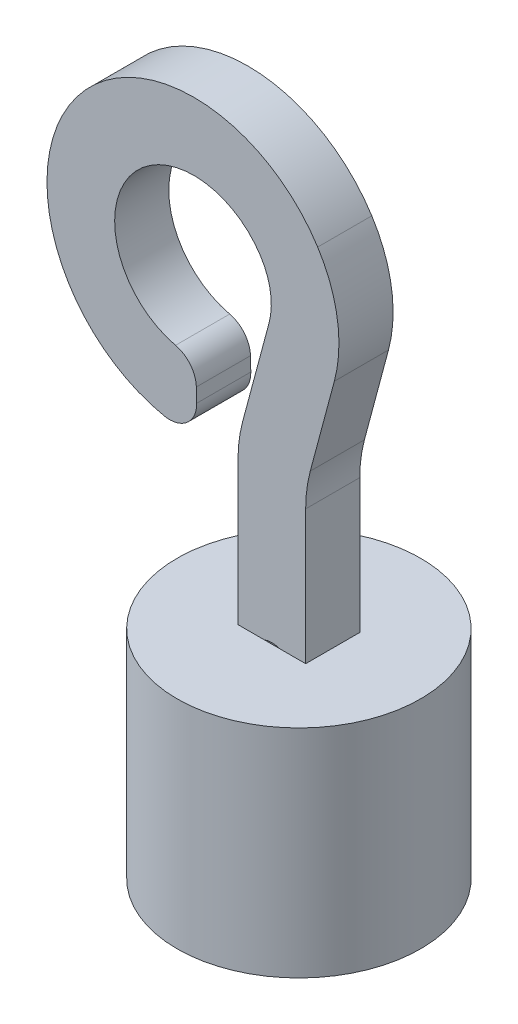
ISO-10303-21;
HEADER;
FILE_DESCRIPTION(('STEP AP214'),'2;1');
FILE_NAME('part.step','',(''),(''),'','','');
FILE_SCHEMA(('AUTOMOTIVE_DESIGN { 1 0 10303 214 1 1 1 1 }'));
ENDSEC;
DATA;
#1=APPLICATION_CONTEXT('core data for automotive mechanical design processes');
#2=APPLICATION_PROTOCOL_DEFINITION('international standard','automotive_design',2000,#1);
#3=PRODUCT_CONTEXT('',#1,'mechanical');
#4=PRODUCT('Part','Part','',(#3));
#5=PRODUCT_RELATED_PRODUCT_CATEGORY('part','',(#4));
#6=PRODUCT_DEFINITION_FORMATION('','',#4);
#7=PRODUCT_DEFINITION_CONTEXT('part definition',#1,'design');
#8=PRODUCT_DEFINITION('design','',#6,#7);
#9=PRODUCT_DEFINITION_SHAPE('','',#8);
#10=(LENGTH_UNIT() NAMED_UNIT(*) SI_UNIT(.MILLI.,.METRE.));
#11=(NAMED_UNIT(*) PLANE_ANGLE_UNIT() SI_UNIT($,.RADIAN.));
#12=(NAMED_UNIT(*) SI_UNIT($,.STERADIAN.) SOLID_ANGLE_UNIT());
#13=UNCERTAINTY_MEASURE_WITH_UNIT(LENGTH_MEASURE(1.E-05),#10,'distance_accuracy_value','');
#14=(GEOMETRIC_REPRESENTATION_CONTEXT(3) GLOBAL_UNCERTAINTY_ASSIGNED_CONTEXT((#13)) GLOBAL_UNIT_ASSIGNED_CONTEXT((#10,
#11,#12)) REPRESENTATION_CONTEXT('',''));
#15=CARTESIAN_POINT('',(0.,0.,0.));
#16=DIRECTION('',(0.,0.,1.));
#17=DIRECTION('',(1.,0.,0.));
#18=AXIS2_PLACEMENT_3D('',#15,#16,#17);
#19=CARTESIAN_POINT('',(-79.7540999308262,11.1014788973685,33.941295670284));
#20=DIRECTION('',(0.,0.,-1.));
#21=DIRECTION('',(-1.,0.,0.));
#22=AXIS2_PLACEMENT_3D('',#19,#20,#21);
#23=PLANE('',#22);
#24=CARTESIAN_POINT('',(-77.2540999308262,19.6014788973685,33.941295670284));
#25=DIRECTION('',(0.,0.,-1.));
#26=DIRECTION('',(0.,1.,0.));
#27=AXIS2_PLACEMENT_3D('',#24,#25,#26);
#28=CIRCLE('',#27,1.6);
#29=CARTESIAN_POINT('',(-76.6973234945432,21.1014788973685,33.941295670284));
#30=VERTEX_POINT('',#29);
#31=CARTESIAN_POINT('',(-77.8108763671092,21.1014788973685,33.941295670284));
#32=VERTEX_POINT('',#31);
#33=EDGE_CURVE('E213',#30,#32,#28,.T.);
#34=ORIENTED_EDGE('',*,*,#33,.F.);
#35=DIRECTION('',(-1.,0.,0.));
#36=VECTOR('',#35,1.);
#37=CARTESIAN_POINT('',(-79.7540999308262,21.1014788973685,33.941295670284));
#38=LINE('',#37,#36);
#39=EDGE_CURVE('E325',#30,#32,#38,.T.);
#40=ORIENTED_EDGE('',*,*,#39,.T.);
#41=EDGE_LOOP('',(#34,#40));
#42=FACE_BOUND('',#41,.T.);
#43=ADVANCED_FACE('F33',(#42),#23,.F.);
#44=CARTESIAN_POINT('',(-79.7540999308262,11.1014788973685,37.941295670284));
#45=DIRECTION('',(0.,0.,1.));
#46=DIRECTION('',(1.,0.,0.));
#47=AXIS2_PLACEMENT_3D('',#44,#45,#46);
#48=PLANE('',#47);
#49=CARTESIAN_POINT('',(-77.2540999308262,19.6014788973685,37.941295670284));
#50=DIRECTION('',(0.,0.,1.));
#51=DIRECTION('',(0.,-1.,0.));
#52=AXIS2_PLACEMENT_3D('',#49,#50,#51);
#53=CIRCLE('',#52,1.6);
#54=CARTESIAN_POINT('',(-77.8108763671092,21.1014788973685,37.941295670284));
#55=VERTEX_POINT('',#54);
#56=CARTESIAN_POINT('',(-76.6973234945432,21.1014788973685,37.941295670284));
#57=VERTEX_POINT('',#56);
#58=EDGE_CURVE('E205',#55,#57,#53,.T.);
#59=ORIENTED_EDGE('',*,*,#58,.F.);
#60=DIRECTION('',(1.,0.,0.));
#61=VECTOR('',#60,1.);
#62=CARTESIAN_POINT('',(-79.7540999308262,21.1014788973685,37.941295670284));
#63=LINE('',#62,#61);
#64=EDGE_CURVE('E318',#55,#57,#63,.T.);
#65=ORIENTED_EDGE('',*,*,#64,.T.);
#66=EDGE_LOOP('',(#59,#65));
#67=FACE_BOUND('',#66,.T.);
#68=ADVANCED_FACE('F344',(#67),#48,.F.);
#69=CARTESIAN_POINT('',(-82.7040999308262,21.1014788973685,35.941295670284));
#70=DIRECTION('',(0.,1.,0.));
#71=DIRECTION('',(0.,0.,1.));
#72=AXIS2_PLACEMENT_3D('',#69,#70,#71);
#73=PLANE('',#72);
#74=DIRECTION('',(0.,0.,1.));
#75=VECTOR('',#74,1.);
#76=CARTESIAN_POINT('',(-79.7540999308262,21.1014788973685,37.941295670284));
#77=LINE('',#76,#75);
#78=CARTESIAN_POINT('',(-79.7540999308262,21.1014788973685,33.941295670284));
#79=VERTEX_POINT('',#78);
#80=CARTESIAN_POINT('',(-79.7540999308262,21.1014788973685,37.941295670284));
#81=VERTEX_POINT('',#80);
#82=EDGE_CURVE('E315',#79,#81,#77,.T.);
#83=ORIENTED_EDGE('',*,*,#82,.F.);
#84=DIRECTION('',(-1.,0.,0.));
#85=VECTOR('',#84,1.);
#86=CARTESIAN_POINT('',(-82.7040999308262,21.1014788973685,33.941295670284));
#87=LINE('',#86,#85);
#88=EDGE_CURVE('E311',#32,#79,#87,.T.);
#89=ORIENTED_EDGE('',*,*,#88,.F.);
#90=ORIENTED_EDGE('',*,*,#39,.F.);
#91=CARTESIAN_POINT('',(-74.7540999308262,21.1014788973685,33.941295670284));
#92=VERTEX_POINT('',#91);
#93=EDGE_CURVE('E326',#92,#30,#38,.T.);
#94=ORIENTED_EDGE('',*,*,#93,.F.);
#95=DIRECTION('',(0.,0.,-1.));
#96=VECTOR('',#95,1.);
#97=CARTESIAN_POINT('',(-74.7540999308262,21.1014788973685,37.941295670284));
#98=LINE('',#97,#96);
#99=CARTESIAN_POINT('',(-74.7540999308262,21.1014788973685,37.941295670284));
#100=VERTEX_POINT('',#99);
#101=EDGE_CURVE('E322',#100,#92,#98,.T.);
#102=ORIENTED_EDGE('',*,*,#101,.F.);
#103=DIRECTION('',(-1.,0.,0.));
#104=VECTOR('',#103,1.);
#105=CARTESIAN_POINT('',(-82.7040999308262,21.1014788973685,37.941295670284));
#106=LINE('',#105,#104);
#107=EDGE_CURVE('E56',#100,#57,#106,.T.);
#108=ORIENTED_EDGE('',*,*,#107,.T.);
#109=ORIENTED_EDGE('',*,*,#64,.F.);
#110=EDGE_CURVE('E319',#81,#55,#63,.T.);
#111=ORIENTED_EDGE('',*,*,#110,.F.);
#112=EDGE_LOOP('',(#83,#89,#90,#94,#102,#108,#109,#111));
#113=FACE_BOUND('',#112,.T.);
#114=CARTESIAN_POINT('',(-77.2540999308262,21.1014788973685,35.941295670284));
#115=DIRECTION('',(0.,1.,0.));
#116=DIRECTION('',(0.,0.,1.));
#117=AXIS2_PLACEMENT_3D('',#114,#115,#116);
#118=CIRCLE('',#117,9.);
#119=CARTESIAN_POINT('',(-77.2540999308262,21.1014788973685,44.941295670284));
#120=VERTEX_POINT('',#119);
#121=EDGE_CURVE('E41',#120,#120,#118,.T.);
#122=ORIENTED_EDGE('',*,*,#121,.T.);
#123=EDGE_LOOP('',(#122));
#124=FACE_BOUND('',#123,.T.);
#125=ADVANCED_FACE('F331',(#113,#124),#73,.T.);
#126=CARTESIAN_POINT('',(-77.2540999308262,5.10147889736845,35.941295670284));
#127=DIRECTION('',(0.,1.,0.));
#128=DIRECTION('',(0.,0.,1.));
#129=AXIS2_PLACEMENT_3D('',#126,#127,#128);
#130=CYLINDRICAL_SURFACE('',#129,9.);
#131=CARTESIAN_POINT('',(-77.2540999308262,5.10147889736845,35.941295670284));
#132=DIRECTION('',(0.,1.,0.));
#133=DIRECTION('',(0.,0.,1.));
#134=AXIS2_PLACEMENT_3D('',#131,#132,#133);
#135=CIRCLE('',#134,9.);
#136=CARTESIAN_POINT('',(-77.2540999308262,5.10147889736845,44.941295670284));
#137=VERTEX_POINT('',#136);
#138=EDGE_CURVE('E11',#137,#137,#135,.T.);
#139=ORIENTED_EDGE('',*,*,#138,.T.);
#140=EDGE_LOOP('',(#139));
#141=FACE_BOUND('',#140,.T.);
#142=ORIENTED_EDGE('',*,*,#121,.F.);
#143=EDGE_LOOP('',(#142));
#144=FACE_BOUND('',#143,.T.);
#145=ADVANCED_FACE('F35',(#141,#144),#130,.T.);
#146=CARTESIAN_POINT('',(-77.2540999308262,5.10147889736845,35.941295670284));
#147=DIRECTION('',(0.,1.,0.));
#148=DIRECTION('',(0.,0.,1.));
#149=AXIS2_PLACEMENT_3D('',#146,#147,#148);
#150=PLANE('',#149);
#151=DIRECTION('',(1.,0.,0.));
#152=VECTOR('',#151,1.);
#153=CARTESIAN_POINT('',(-80.2540999308262,5.10147889736845,33.941295670284));
#154=LINE('',#153,#152);
#155=CARTESIAN_POINT('',(-80.2540999308262,5.10147889736845,33.941295670284));
#156=VERTEX_POINT('',#155);
#157=CARTESIAN_POINT('',(-74.2540999308262,5.10147889736845,33.941295670284));
#158=VERTEX_POINT('',#157);
#159=EDGE_CURVE('E199',#156,#158,#154,.T.);
#160=ORIENTED_EDGE('',*,*,#159,.F.);
#161=DIRECTION('',(0.,0.,-1.));
#162=VECTOR('',#161,1.);
#163=CARTESIAN_POINT('',(-80.2540999308262,5.10147889736845,37.941295670284));
#164=LINE('',#163,#162);
#165=CARTESIAN_POINT('',(-80.2540999308262,5.10147889736845,37.941295670284));
#166=VERTEX_POINT('',#165);
#167=EDGE_CURVE('E48',#166,#156,#164,.T.);
#168=ORIENTED_EDGE('',*,*,#167,.F.);
#169=DIRECTION('',(-1.,0.,0.));
#170=VECTOR('',#169,1.);
#171=CARTESIAN_POINT('',(-80.2540999308262,5.10147889736845,37.941295670284));
#172=LINE('',#171,#170);
#173=CARTESIAN_POINT('',(-74.2540999308262,5.10147889736845,37.941295670284));
#174=VERTEX_POINT('',#173);
#175=EDGE_CURVE('E190',#174,#166,#172,.T.);
#176=ORIENTED_EDGE('',*,*,#175,.F.);
#177=DIRECTION('',(0.,0.,1.));
#178=VECTOR('',#177,1.);
#179=CARTESIAN_POINT('',(-74.2540999308262,5.10147889736845,37.941295670284));
#180=LINE('',#179,#178);
#181=EDGE_CURVE('E193',#158,#174,#180,.T.);
#182=ORIENTED_EDGE('',*,*,#181,.F.);
#183=EDGE_LOOP('',(#160,#168,#176,#182));
#184=FACE_BOUND('',#183,.T.);
#185=ORIENTED_EDGE('',*,*,#138,.F.);
#186=EDGE_LOOP('',(#185));
#187=FACE_BOUND('',#186,.T.);
#188=ADVANCED_FACE('F334',(#184,#187),#150,.F.);
#189=CARTESIAN_POINT('',(-74.7540999308262,17.1014788973685,33.941295670284));
#190=DIRECTION('',(1.,0.,0.));
#191=DIRECTION('',(0.,1.,0.));
#192=AXIS2_PLACEMENT_3D('',#189,#190,#191);
#193=PLANE('',#192);
#194=DIRECTION('',(0.,1.,0.));
#195=VECTOR('',#194,1.);
#196=CARTESIAN_POINT('',(-74.7540999308262,17.1014788973685,37.941295670284));
#197=LINE('',#196,#195);
#198=CARTESIAN_POINT('',(-74.7540999308262,31.0104431729025,37.941295670284));
#199=VERTEX_POINT('',#198);
#200=EDGE_CURVE('E216',#100,#199,#197,.T.);
#201=ORIENTED_EDGE('',*,*,#200,.F.);
#202=ORIENTED_EDGE('',*,*,#101,.T.);
#203=DIRECTION('',(0.,1.,0.));
#204=VECTOR('',#203,1.);
#205=CARTESIAN_POINT('',(-74.7540999308262,17.1014788973685,33.941295670284));
#206=LINE('',#205,#204);
#207=CARTESIAN_POINT('',(-74.7540999308262,31.0104431729025,33.941295670284));
#208=VERTEX_POINT('',#207);
#209=EDGE_CURVE('E217',#92,#208,#206,.T.);
#210=ORIENTED_EDGE('',*,*,#209,.T.);
#211=DIRECTION('',(0.,0.,1.));
#212=VECTOR('',#211,1.);
#213=CARTESIAN_POINT('',(-74.7540999308262,31.0104431729025,33.941295670284));
#214=LINE('',#213,#212);
#215=EDGE_CURVE('E242',#208,#199,#214,.T.);
#216=ORIENTED_EDGE('',*,*,#215,.T.);
#217=EDGE_LOOP('',(#201,#202,#210,#216));
#218=FACE_BOUND('',#217,.T.);
#219=ADVANCED_FACE('F341',(#218),#193,.T.);
#220=CARTESIAN_POINT('',(-79.7540999308262,17.1014788973685,33.941295670284));
#221=DIRECTION('',(-1.,0.,0.));
#222=DIRECTION('',(0.,-1.,0.));
#223=AXIS2_PLACEMENT_3D('',#220,#221,#222);
#224=PLANE('',#223);
#225=DIRECTION('',(0.,-1.,0.));
#226=VECTOR('',#225,1.);
#227=CARTESIAN_POINT('',(-79.7540999308262,17.1014788973685,33.941295670284));
#228=LINE('',#227,#226);
#229=CARTESIAN_POINT('',(-79.7540999308262,31.6687056608394,33.941295670284));
#230=VERTEX_POINT('',#229);
#231=EDGE_CURVE('E239',#230,#79,#228,.T.);
#232=ORIENTED_EDGE('',*,*,#231,.T.);
#233=ORIENTED_EDGE('',*,*,#82,.T.);
#234=DIRECTION('',(0.,-1.,0.));
#235=VECTOR('',#234,1.);
#236=CARTESIAN_POINT('',(-79.7540999308262,17.1014788973685,37.941295670284));
#237=LINE('',#236,#235);
#238=CARTESIAN_POINT('',(-79.7540999308262,31.6687056608394,37.941295670284));
#239=VERTEX_POINT('',#238);
#240=EDGE_CURVE('E220',#239,#81,#237,.T.);
#241=ORIENTED_EDGE('',*,*,#240,.F.);
#242=DIRECTION('',(0.,0.,1.));
#243=VECTOR('',#242,1.);
#244=CARTESIAN_POINT('',(-79.7540999308262,31.6687056608394,33.941295670284));
#245=LINE('',#244,#243);
#246=EDGE_CURVE('E265',#230,#239,#245,.T.);
#247=ORIENTED_EDGE('',*,*,#246,.F.);
#248=EDGE_LOOP('',(#232,#233,#241,#247));
#249=FACE_BOUND('',#248,.T.);
#250=ADVANCED_FACE('F374',(#249),#224,.T.);
#251=CARTESIAN_POINT('',(-69.7540999308262,31.6687056608395,33.941295670284));
#252=DIRECTION('',(0.,0.,1.));
#253=DIRECTION('',(0.,-1.,0.));
#254=AXIS2_PLACEMENT_3D('',#251,#252,#253);
#255=CYLINDRICAL_SURFACE('',#254,10.);
#256=CARTESIAN_POINT('',(-69.7540999308262,31.6687056608395,37.941295670284));
#257=DIRECTION('',(0.,0.,1.));
#258=DIRECTION('',(0.,1.,0.));
#259=AXIS2_PLACEMENT_3D('',#256,#257,#258);
#260=CIRCLE('',#259,10.);
#261=CARTESIAN_POINT('',(-79.4133581937169,34.2568961118647,37.941295670284));
#262=VERTEX_POINT('',#261);
#263=EDGE_CURVE('E260',#262,#239,#260,.T.);
#264=ORIENTED_EDGE('',*,*,#263,.F.);
#265=DIRECTION('',(0.,0.,1.));
#266=VECTOR('',#265,1.);
#267=CARTESIAN_POINT('',(-79.4133581937169,34.2568961118647,33.941295670284));
#268=LINE('',#267,#266);
#269=CARTESIAN_POINT('',(-79.4133581937169,34.2568961118647,33.941295670284));
#270=VERTEX_POINT('',#269);
#271=EDGE_CURVE('E268',#270,#262,#268,.T.);
#272=ORIENTED_EDGE('',*,*,#271,.F.);
#273=CARTESIAN_POINT('',(-69.7540999308262,31.6687056608395,33.941295670284));
#274=DIRECTION('',(0.,0.,1.));
#275=DIRECTION('',(0.,1.,0.));
#276=AXIS2_PLACEMENT_3D('',#273,#274,#275);
#277=CIRCLE('',#276,10.);
#278=EDGE_CURVE('E236',#270,#230,#277,.T.);
#279=ORIENTED_EDGE('',*,*,#278,.T.);
#280=ORIENTED_EDGE('',*,*,#246,.T.);
#281=EDGE_LOOP('',(#264,#272,#279,#280));
#282=FACE_BOUND('',#281,.T.);
#283=ADVANCED_FACE('F400',(#282),#255,.T.);
#284=CARTESIAN_POINT('',(-79.4133581937169,34.2568961118647,33.941295670284));
#285=DIRECTION('',(-0.965925826289068,0.258819045102522,0.));
#286=DIRECTION('',(-0.258819045102522,-0.965925826289068,0.));
#287=AXIS2_PLACEMENT_3D('',#284,#285,#286);
#288=PLANE('',#287);
#289=DIRECTION('',(-0.258819045102522,-0.965925826289068,0.));
#290=VECTOR('',#289,1.);
#291=CARTESIAN_POINT('',(-79.4133581937169,34.2568961118647,37.941295670284));
#292=LINE('',#291,#290);
#293=CARTESIAN_POINT('',(-77.4640473628565,41.53182317238,37.941295670284));
#294=VERTEX_POINT('',#293);
#295=EDGE_CURVE('E258',#294,#262,#292,.T.);
#296=ORIENTED_EDGE('',*,*,#295,.F.);
#297=DIRECTION('',(0.,0.,-1.));
#298=VECTOR('',#297,1.);
#299=CARTESIAN_POINT('',(-77.4640473628565,41.53182317238,33.941295670284));
#300=LINE('',#299,#298);
#301=CARTESIAN_POINT('',(-77.4640473628565,41.53182317238,33.941295670284));
#302=VERTEX_POINT('',#301);
#303=EDGE_CURVE('E296',#294,#302,#300,.T.);
#304=ORIENTED_EDGE('',*,*,#303,.T.);
#305=DIRECTION('',(-0.258819045102522,-0.965925826289068,0.));
#306=VECTOR('',#305,1.);
#307=CARTESIAN_POINT('',(-79.4133581937169,34.2568961118647,33.941295670284));
#308=LINE('',#307,#306);
#309=EDGE_CURVE('E234',#302,#270,#308,.T.);
#310=ORIENTED_EDGE('',*,*,#309,.T.);
#311=ORIENTED_EDGE('',*,*,#271,.T.);
#312=EDGE_LOOP('',(#296,#304,#310,#311));
#313=FACE_BOUND('',#312,.T.);
#314=ADVANCED_FACE('F396',(#313),#288,.T.);
#315=CARTESIAN_POINT('',(-83.0141378764453,42.3657756373815,33.941295670284));
#316=DIRECTION('',(0.,0.,1.));
#317=DIRECTION('',(0.,-1.,0.));
#318=AXIS2_PLACEMENT_3D('',#315,#316,#317);
#319=CYLINDRICAL_SURFACE('',#318,5.85486604986444);
#320=CARTESIAN_POINT('',(-83.0141378764453,42.3657756373815,33.941295670284));
#321=DIRECTION('',(0.,0.,-1.));
#322=DIRECTION('',(0.,1.,0.));
#323=AXIS2_PLACEMENT_3D('',#320,#321,#322);
#324=CIRCLE('',#323,5.85486604986444);
#325=CARTESIAN_POINT('',(-84.3688357945145,36.6697902079204,33.941295670284));
#326=VERTEX_POINT('',#325);
#327=CARTESIAN_POINT('',(-78.0797918613953,45.5172333739878,33.941295670284));
#328=VERTEX_POINT('',#327);
#329=EDGE_CURVE('E231',#326,#328,#324,.T.);
#330=ORIENTED_EDGE('',*,*,#329,.T.);
#331=DIRECTION('',(0.,0.,1.));
#332=VECTOR('',#331,1.);
#333=CARTESIAN_POINT('',(-78.0797918613953,45.5172333739878,33.941295670284));
#334=LINE('',#333,#332);
#335=CARTESIAN_POINT('',(-78.0797918613953,45.5172333739878,37.941295670284));
#336=VERTEX_POINT('',#335);
#337=EDGE_CURVE('E293',#328,#336,#334,.T.);
#338=ORIENTED_EDGE('',*,*,#337,.T.);
#339=CARTESIAN_POINT('',(-83.0141378764453,42.3657756373815,37.941295670284));
#340=DIRECTION('',(0.,0.,-1.));
#341=DIRECTION('',(0.,1.,0.));
#342=AXIS2_PLACEMENT_3D('',#339,#340,#341);
#343=CIRCLE('',#342,5.85486604986444);
#344=CARTESIAN_POINT('',(-84.3688357945145,36.6697902079204,37.941295670284));
#345=VERTEX_POINT('',#344);
#346=EDGE_CURVE('E255',#345,#336,#343,.T.);
#347=ORIENTED_EDGE('',*,*,#346,.F.);
#348=DIRECTION('',(0.,0.,1.));
#349=VECTOR('',#348,1.);
#350=CARTESIAN_POINT('',(-84.3688357945145,36.6697902079204,33.941295670284));
#351=LINE('',#350,#349);
#352=EDGE_CURVE('E291',#345,#326,#351,.F.);
#353=ORIENTED_EDGE('',*,*,#352,.T.);
#354=EDGE_LOOP('',(#330,#338,#347,#353));
#355=FACE_BOUND('',#354,.T.);
#356=ADVANCED_FACE('F392',(#355),#319,.F.);
#357=CARTESIAN_POINT('',(-82.873879366346,36.5125898371357,33.941295670284));
#358=DIRECTION('',(0.999713016556783,0.0239558871039502,0.));
#359=DIRECTION('',(-0.0239558871039502,0.999713016556783,0.));
#360=AXIS2_PLACEMENT_3D('',#357,#358,#359);
#361=PLANE('',#360);
#362=DIRECTION('',(-0.0239558871039502,0.999713016556783,0.));
#363=VECTOR('',#362,1.);
#364=CARTESIAN_POINT('',(-82.873879366346,36.5125898371357,37.941295670284));
#365=LINE('',#364,#363);
#366=CARTESIAN_POINT('',(-82.8074933156898,33.7422061451961,37.941295670284));
#367=VERTEX_POINT('',#366);
#368=CARTESIAN_POINT('',(-82.8321694237165,34.7719749984706,37.941295670284));
#369=VERTEX_POINT('',#368);
#370=EDGE_CURVE('E252',#367,#369,#365,.T.);
#371=ORIENTED_EDGE('',*,*,#370,.F.);
#372=DIRECTION('',(0.,0.,1.));
#373=VECTOR('',#372,1.);
#374=CARTESIAN_POINT('',(-82.8074933156898,33.7422061451961,33.941295670284));
#375=LINE('',#374,#373);
#376=CARTESIAN_POINT('',(-82.8074933156898,33.7422061451961,33.941295670284));
#377=VERTEX_POINT('',#376);
#378=EDGE_CURVE('E284',#367,#377,#375,.F.);
#379=ORIENTED_EDGE('',*,*,#378,.T.);
#380=DIRECTION('',(-0.0239558871039502,0.999713016556783,0.));
#381=VECTOR('',#380,1.);
#382=CARTESIAN_POINT('',(-82.873879366346,36.5125898371357,33.941295670284));
#383=LINE('',#382,#381);
#384=CARTESIAN_POINT('',(-82.8321694237165,34.7719749984706,33.941295670284));
#385=VERTEX_POINT('',#384);
#386=EDGE_CURVE('E228',#377,#385,#383,.T.);
#387=ORIENTED_EDGE('',*,*,#386,.T.);
#388=DIRECTION('',(0.,0.,1.));
#389=VECTOR('',#388,1.);
#390=CARTESIAN_POINT('',(-82.8321694237165,34.7719749984706,33.941295670284));
#391=LINE('',#390,#389);
#392=EDGE_CURVE('E281',#385,#369,#391,.T.);
#393=ORIENTED_EDGE('',*,*,#392,.T.);
#394=EDGE_LOOP('',(#371,#379,#387,#393));
#395=FACE_BOUND('',#394,.T.);
#396=ADVANCED_FACE('F388',(#395),#361,.T.);
#397=CARTESIAN_POINT('',(-83.0141378764453,42.3657756373815,33.941295670284));
#398=DIRECTION('',(0.,0.,1.));
#399=DIRECTION('',(0.,-1.,0.));
#400=AXIS2_PLACEMENT_3D('',#397,#398,#399);
#401=CYLINDRICAL_SURFACE('',#400,10.8548660498644);
#402=CARTESIAN_POINT('',(-83.0141378764453,42.3657756373815,37.941295670284));
#403=DIRECTION('',(0.,0.,1.));
#404=DIRECTION('',(0.,1.,0.));
#405=AXIS2_PLACEMENT_3D('',#402,#403,#404);
#406=CIRCLE('',#405,10.8548660498644);
#407=CARTESIAN_POINT('',(-73.8659072284888,48.208548350083,37.941295670284));
#408=VERTEX_POINT('',#407);
#409=CARTESIAN_POINT('',(-85.2118450613466,31.7357144856321,37.941295670284));
#410=VERTEX_POINT('',#409);
#411=EDGE_CURVE('E250',#408,#410,#406,.T.);
#412=ORIENTED_EDGE('',*,*,#411,.F.);
#413=DIRECTION('',(0.,0.,1.));
#414=VECTOR('',#413,1.);
#415=CARTESIAN_POINT('',(-73.8659072284888,48.208548350083,33.941295670284));
#416=LINE('',#415,#414);
#417=CARTESIAN_POINT('',(-73.8659072284888,48.208548350083,33.941295670284));
#418=VERTEX_POINT('',#417);
#419=EDGE_CURVE('E307',#408,#418,#416,.F.);
#420=ORIENTED_EDGE('',*,*,#419,.T.);
#421=CARTESIAN_POINT('',(-83.0141378764453,42.3657756373815,33.941295670284));
#422=DIRECTION('',(0.,0.,1.));
#423=DIRECTION('',(0.,1.,0.));
#424=AXIS2_PLACEMENT_3D('',#421,#422,#423);
#425=CIRCLE('',#424,10.8548660498644);
#426=CARTESIAN_POINT('',(-85.2118450613466,31.7357144856321,33.941295670284));
#427=VERTEX_POINT('',#426);
#428=EDGE_CURVE('E226',#418,#427,#425,.T.);
#429=ORIENTED_EDGE('',*,*,#428,.T.);
#430=DIRECTION('',(0.,0.,1.));
#431=VECTOR('',#430,1.);
#432=CARTESIAN_POINT('',(-85.2118450613466,31.7357144856321,33.941295670284));
#433=LINE('',#432,#431);
#434=EDGE_CURVE('E267',#427,#410,#433,.T.);
#435=ORIENTED_EDGE('',*,*,#434,.T.);
#436=EDGE_LOOP('',(#412,#420,#429,#435));
#437=FACE_BOUND('',#436,.T.);
#438=ADVANCED_FACE('F384',(#437),#401,.T.);
#439=CARTESIAN_POINT('',(-74.4133581937169,33.5986336239277,33.941295670284));
#440=DIRECTION('',(0.965925826289068,-0.258819045102521,0.));
#441=DIRECTION('',(0.258819045102521,0.965925826289068,0.));
#442=AXIS2_PLACEMENT_3D('',#439,#440,#441);
#443=PLANE('',#442);
#444=DIRECTION('',(0.258819045102521,0.965925826289068,0.));
#445=VECTOR('',#444,1.);
#446=CARTESIAN_POINT('',(-74.4133581937169,33.5986336239277,33.941295670284));
#447=LINE('',#446,#445);
#448=CARTESIAN_POINT('',(-74.4133581937169,33.5986336239277,33.941295670284));
#449=VERTEX_POINT('',#448);
#450=CARTESIAN_POINT('',(-72.6344182314111,40.2377279468674,33.941295670284));
#451=VERTEX_POINT('',#450);
#452=EDGE_CURVE('E223',#449,#451,#447,.T.);
#453=ORIENTED_EDGE('',*,*,#452,.T.);
#454=DIRECTION('',(0.,0.,1.));
#455=VECTOR('',#454,1.);
#456=CARTESIAN_POINT('',(-72.6344182314111,40.2377279468674,33.941295670284));
#457=LINE('',#456,#455);
#458=CARTESIAN_POINT('',(-72.6344182314111,40.2377279468674,37.941295670284));
#459=VERTEX_POINT('',#458);
#460=EDGE_CURVE('E302',#451,#459,#457,.T.);
#461=ORIENTED_EDGE('',*,*,#460,.T.);
#462=DIRECTION('',(0.258819045102521,0.965925826289068,0.));
#463=VECTOR('',#462,1.);
#464=CARTESIAN_POINT('',(-74.4133581937169,33.5986336239277,37.941295670284));
#465=LINE('',#464,#463);
#466=CARTESIAN_POINT('',(-74.4133581937169,33.5986336239277,37.941295670284));
#467=VERTEX_POINT('',#466);
#468=EDGE_CURVE('E247',#467,#459,#465,.T.);
#469=ORIENTED_EDGE('',*,*,#468,.F.);
#470=DIRECTION('',(0.,0.,1.));
#471=VECTOR('',#470,1.);
#472=CARTESIAN_POINT('',(-74.4133581937169,33.5986336239277,33.941295670284));
#473=LINE('',#472,#471);
#474=EDGE_CURVE('E271',#449,#467,#473,.T.);
#475=ORIENTED_EDGE('',*,*,#474,.F.);
#476=EDGE_LOOP('',(#453,#461,#469,#475));
#477=FACE_BOUND('',#476,.T.);
#478=ADVANCED_FACE('F380',(#477),#443,.T.);
#479=CARTESIAN_POINT('',(-64.7540999308262,31.0104431729025,33.941295670284));
#480=DIRECTION('',(0.,0.,1.));
#481=DIRECTION('',(0.,-1.,0.));
#482=AXIS2_PLACEMENT_3D('',#479,#480,#481);
#483=CYLINDRICAL_SURFACE('',#482,10.);
#484=CARTESIAN_POINT('',(-64.7540999308262,31.0104431729025,37.941295670284));
#485=DIRECTION('',(0.,0.,-1.));
#486=DIRECTION('',(0.,1.,0.));
#487=AXIS2_PLACEMENT_3D('',#484,#485,#486);
#488=CIRCLE('',#487,10.);
#489=EDGE_CURVE('E244',#199,#467,#488,.T.);
#490=ORIENTED_EDGE('',*,*,#489,.F.);
#491=ORIENTED_EDGE('',*,*,#215,.F.);
#492=CARTESIAN_POINT('',(-64.7540999308262,31.0104431729025,33.941295670284));
#493=DIRECTION('',(0.,0.,-1.));
#494=DIRECTION('',(0.,1.,0.));
#495=AXIS2_PLACEMENT_3D('',#492,#493,#494);
#496=CIRCLE('',#495,10.);
#497=EDGE_CURVE('E219',#208,#449,#496,.T.);
#498=ORIENTED_EDGE('',*,*,#497,.T.);
#499=ORIENTED_EDGE('',*,*,#474,.T.);
#500=EDGE_LOOP('',(#490,#491,#498,#499));
#501=FACE_BOUND('',#500,.T.);
#502=ADVANCED_FACE('F376',(#501),#483,.F.);
#503=CARTESIAN_POINT('',(-64.7540999308262,31.0104431729025,33.941295670284));
#504=DIRECTION('',(0.,0.,-1.));
#505=DIRECTION('',(0.,1.,0.));
#506=AXIS2_PLACEMENT_3D('',#503,#504,#505);
#507=PLANE('',#506);
#508=ORIENTED_EDGE('',*,*,#209,.F.);
#509=ORIENTED_EDGE('',*,*,#93,.T.);
#510=EDGE_CURVE('E212',#32,#30,#28,.T.);
#511=ORIENTED_EDGE('',*,*,#510,.F.);
#512=ORIENTED_EDGE('',*,*,#88,.T.);
#513=ORIENTED_EDGE('',*,*,#231,.F.);
#514=ORIENTED_EDGE('',*,*,#278,.F.);
#515=ORIENTED_EDGE('',*,*,#309,.F.);
#516=CARTESIAN_POINT('',(-82.2936764943018,42.8259183978926,33.941295670284));
#517=DIRECTION('',(0.,0.,-1.));
#518=DIRECTION('',(0.,1.,0.));
#519=AXIS2_PLACEMENT_3D('',#516,#517,#518);
#520=CIRCLE('',#519,5.);
#521=EDGE_CURVE('E300',#302,#328,#520,.F.);
#522=ORIENTED_EDGE('',*,*,#521,.T.);
#523=ORIENTED_EDGE('',*,*,#329,.F.);
#524=CARTESIAN_POINT('',(-84.8315954568301,34.7240632242627,33.941295670284));
#525=DIRECTION('',(0.,0.,-1.));
#526=DIRECTION('',(0.,1.,0.));
#527=AXIS2_PLACEMENT_3D('',#524,#525,#526);
#528=CIRCLE('',#527,2.);
#529=EDGE_CURVE('E286',#326,#385,#528,.T.);
#530=ORIENTED_EDGE('',*,*,#529,.T.);
#531=ORIENTED_EDGE('',*,*,#386,.F.);
#532=CARTESIAN_POINT('',(-84.8069193488034,33.6942943709882,33.941295670284));
#533=DIRECTION('',(0.,0.,-1.));
#534=DIRECTION('',(0.,1.,0.));
#535=AXIS2_PLACEMENT_3D('',#532,#533,#534);
#536=CIRCLE('',#535,2.);
#537=EDGE_CURVE('E288',#377,#427,#536,.T.);
#538=ORIENTED_EDGE('',*,*,#537,.T.);
#539=ORIENTED_EDGE('',*,*,#428,.F.);
#540=CARTESIAN_POINT('',(-82.2936764943018,42.8259183978926,33.941295670284));
#541=DIRECTION('',(0.,0.,-1.));
#542=DIRECTION('',(0.,1.,0.));
#543=AXIS2_PLACEMENT_3D('',#540,#541,#542);
#544=CIRCLE('',#543,10.);
#545=EDGE_CURVE('E309',#418,#451,#544,.T.);
#546=ORIENTED_EDGE('',*,*,#545,.T.);
#547=ORIENTED_EDGE('',*,*,#452,.F.);
#548=ORIENTED_EDGE('',*,*,#497,.F.);
#549=EDGE_LOOP('',(#508,#509,#511,#512,#513,#514,#515,#522,#523,#530,#531,#538,#539,#546,#547,#548));
#550=FACE_BOUND('',#549,.T.);
#551=ADVANCED_FACE('F379',(#550),#507,.T.);
#552=CARTESIAN_POINT('',(-64.7540999308262,31.0104431729025,37.941295670284));
#553=DIRECTION('',(0.,0.,-1.));
#554=DIRECTION('',(0.,1.,0.));
#555=AXIS2_PLACEMENT_3D('',#552,#553,#554);
#556=PLANE('',#555);
#557=ORIENTED_EDGE('',*,*,#107,.F.);
#558=ORIENTED_EDGE('',*,*,#200,.T.);
#559=ORIENTED_EDGE('',*,*,#489,.T.);
#560=ORIENTED_EDGE('',*,*,#468,.T.);
#561=CARTESIAN_POINT('',(-82.2936764943018,42.8259183978926,37.941295670284));
#562=DIRECTION('',(0.,0.,-1.));
#563=DIRECTION('',(0.,1.,0.));
#564=AXIS2_PLACEMENT_3D('',#561,#562,#563);
#565=CIRCLE('',#564,10.);
#566=EDGE_CURVE('E305',#459,#408,#565,.F.);
#567=ORIENTED_EDGE('',*,*,#566,.T.);
#568=ORIENTED_EDGE('',*,*,#411,.T.);
#569=CARTESIAN_POINT('',(-84.8069193488034,33.6942943709882,37.941295670284));
#570=DIRECTION('',(0.,0.,-1.));
#571=DIRECTION('',(0.,1.,0.));
#572=AXIS2_PLACEMENT_3D('',#569,#570,#571);
#573=CIRCLE('',#572,2.);
#574=EDGE_CURVE('E279',#410,#367,#573,.F.);
#575=ORIENTED_EDGE('',*,*,#574,.T.);
#576=ORIENTED_EDGE('',*,*,#370,.T.);
#577=CARTESIAN_POINT('',(-84.8315954568301,34.7240632242627,37.941295670284));
#578=DIRECTION('',(0.,0.,-1.));
#579=DIRECTION('',(0.,1.,0.));
#580=AXIS2_PLACEMENT_3D('',#577,#578,#579);
#581=CIRCLE('',#580,2.);
#582=EDGE_CURVE('E277',#369,#345,#581,.F.);
#583=ORIENTED_EDGE('',*,*,#582,.T.);
#584=ORIENTED_EDGE('',*,*,#346,.T.);
#585=CARTESIAN_POINT('',(-82.2936764943018,42.8259183978926,37.941295670284));
#586=DIRECTION('',(0.,0.,-1.));
#587=DIRECTION('',(0.,1.,0.));
#588=AXIS2_PLACEMENT_3D('',#585,#586,#587);
#589=CIRCLE('',#588,5.);
#590=EDGE_CURVE('E298',#336,#294,#589,.T.);
#591=ORIENTED_EDGE('',*,*,#590,.T.);
#592=ORIENTED_EDGE('',*,*,#295,.T.);
#593=ORIENTED_EDGE('',*,*,#263,.T.);
#594=ORIENTED_EDGE('',*,*,#240,.T.);
#595=ORIENTED_EDGE('',*,*,#110,.T.);
#596=EDGE_CURVE('E209',#57,#55,#53,.T.);
#597=ORIENTED_EDGE('',*,*,#596,.F.);
#598=EDGE_LOOP('',(#557,#558,#559,#560,#567,#568,#575,#576,#583,#584,#591,#592,#593,#594,#595,#597));
#599=FACE_BOUND('',#598,.T.);
#600=ADVANCED_FACE('F371',(#599),#556,.F.);
#601=CARTESIAN_POINT('',(-84.8069193488034,33.6942943709882,33.941295670284));
#602=DIRECTION('',(0.,0.,1.));
#603=DIRECTION('',(0.,-1.,0.));
#604=AXIS2_PLACEMENT_3D('',#601,#602,#603);
#605=CYLINDRICAL_SURFACE('',#604,2.);
#606=ORIENTED_EDGE('',*,*,#537,.F.);
#607=ORIENTED_EDGE('',*,*,#378,.F.);
#608=ORIENTED_EDGE('',*,*,#574,.F.);
#609=ORIENTED_EDGE('',*,*,#434,.F.);
#610=EDGE_LOOP('',(#606,#607,#608,#609));
#611=FACE_BOUND('',#610,.T.);
#612=ADVANCED_FACE('F367',(#611),#605,.T.);
#613=CARTESIAN_POINT('',(-84.8315954568301,34.7240632242627,33.941295670284));
#614=DIRECTION('',(0.,0.,1.));
#615=DIRECTION('',(0.,-1.,0.));
#616=AXIS2_PLACEMENT_3D('',#613,#614,#615);
#617=CYLINDRICAL_SURFACE('',#616,2.);
#618=ORIENTED_EDGE('',*,*,#529,.F.);
#619=ORIENTED_EDGE('',*,*,#352,.F.);
#620=ORIENTED_EDGE('',*,*,#582,.F.);
#621=ORIENTED_EDGE('',*,*,#392,.F.);
#622=EDGE_LOOP('',(#618,#619,#620,#621));
#623=FACE_BOUND('',#622,.T.);
#624=ADVANCED_FACE('F363',(#623),#617,.T.);
#625=CARTESIAN_POINT('',(-82.2936764943018,42.8259183978926,33.941295670284));
#626=DIRECTION('',(0.,0.,1.));
#627=DIRECTION('',(0.,-1.,0.));
#628=AXIS2_PLACEMENT_3D('',#625,#626,#627);
#629=CYLINDRICAL_SURFACE('',#628,5.);
#630=ORIENTED_EDGE('',*,*,#521,.F.);
#631=ORIENTED_EDGE('',*,*,#303,.F.);
#632=ORIENTED_EDGE('',*,*,#590,.F.);
#633=ORIENTED_EDGE('',*,*,#337,.F.);
#634=EDGE_LOOP('',(#630,#631,#632,#633));
#635=FACE_BOUND('',#634,.T.);
#636=ADVANCED_FACE('F359',(#635),#629,.F.);
#637=CARTESIAN_POINT('',(-82.2936764943018,42.8259183978926,33.941295670284));
#638=DIRECTION('',(0.,0.,1.));
#639=DIRECTION('',(0.,-1.,0.));
#640=AXIS2_PLACEMENT_3D('',#637,#638,#639);
#641=CYLINDRICAL_SURFACE('',#640,10.);
#642=ORIENTED_EDGE('',*,*,#545,.F.);
#643=ORIENTED_EDGE('',*,*,#419,.F.);
#644=ORIENTED_EDGE('',*,*,#566,.F.);
#645=ORIENTED_EDGE('',*,*,#460,.F.);
#646=EDGE_LOOP('',(#642,#643,#644,#645));
#647=FACE_BOUND('',#646,.T.);
#648=ADVANCED_FACE('F355',(#647),#641,.T.);
#649=CARTESIAN_POINT('',(-77.2540999308262,19.6014788973685,27.941295670284));
#650=DIRECTION('',(0.,0.,1.));
#651=DIRECTION('',(0.,-1.,0.));
#652=AXIS2_PLACEMENT_3D('',#649,#650,#651);
#653=CYLINDRICAL_SURFACE('',#652,1.6);
#654=ORIENTED_EDGE('',*,*,#33,.T.);
#655=ORIENTED_EDGE('',*,*,#510,.T.);
#656=EDGE_LOOP('',(#654,#655));
#657=FACE_BOUND('',#656,.T.);
#658=ORIENTED_EDGE('',*,*,#596,.T.);
#659=ORIENTED_EDGE('',*,*,#58,.T.);
#660=EDGE_LOOP('',(#658,#659));
#661=FACE_BOUND('',#660,.T.);
#662=ADVANCED_FACE('F358',(#657,#661),#653,.F.);
#663=CARTESIAN_POINT('',(-80.2540999308262,17.1014788973685,37.941295670284));
#664=DIRECTION('',(-1.,0.,0.));
#665=DIRECTION('',(0.,0.,1.));
#666=AXIS2_PLACEMENT_3D('',#663,#664,#665);
#667=PLANE('',#666);
#668=ORIENTED_EDGE('',*,*,#167,.T.);
#669=DIRECTION('',(0.,-1.,0.));
#670=VECTOR('',#669,1.);
#671=CARTESIAN_POINT('',(-80.2540999308262,17.1014788973685,33.941295670284));
#672=LINE('',#671,#670);
#673=CARTESIAN_POINT('',(-80.2540999308262,17.1014788973685,33.941295670284));
#674=VERTEX_POINT('',#673);
#675=EDGE_CURVE('E168',#674,#156,#672,.T.);
#676=ORIENTED_EDGE('',*,*,#675,.F.);
#677=DIRECTION('',(0.,0.,-1.));
#678=VECTOR('',#677,1.);
#679=CARTESIAN_POINT('',(-80.2540999308262,17.1014788973685,37.941295670284));
#680=LINE('',#679,#678);
#681=CARTESIAN_POINT('',(-80.2540999308262,17.1014788973685,37.941295670284));
#682=VERTEX_POINT('',#681);
#683=EDGE_CURVE('E172',#682,#674,#680,.T.);
#684=ORIENTED_EDGE('',*,*,#683,.F.);
#685=DIRECTION('',(0.,-1.,0.));
#686=VECTOR('',#685,1.);
#687=CARTESIAN_POINT('',(-80.2540999308262,17.1014788973685,37.941295670284));
#688=LINE('',#687,#686);
#689=EDGE_CURVE('E203',#682,#166,#688,.T.);
#690=ORIENTED_EDGE('',*,*,#689,.T.);
#691=EDGE_LOOP('',(#668,#676,#684,#690));
#692=FACE_BOUND('',#691,.T.);
#693=ADVANCED_FACE('F170',(#692),#667,.F.);
#694=CARTESIAN_POINT('',(-80.2540999308262,17.1014788973685,37.941295670284));
#695=DIRECTION('',(0.,0.,1.));
#696=DIRECTION('',(1.,0.,0.));
#697=AXIS2_PLACEMENT_3D('',#694,#695,#696);
#698=PLANE('',#697);
#699=ORIENTED_EDGE('',*,*,#175,.T.);
#700=ORIENTED_EDGE('',*,*,#689,.F.);
#701=DIRECTION('',(-1.,0.,0.));
#702=VECTOR('',#701,1.);
#703=CARTESIAN_POINT('',(-80.2540999308262,17.1014788973685,37.941295670284));
#704=LINE('',#703,#702);
#705=CARTESIAN_POINT('',(-74.2540999308262,17.1014788973685,37.941295670284));
#706=VERTEX_POINT('',#705);
#707=EDGE_CURVE('E178',#706,#682,#704,.T.);
#708=ORIENTED_EDGE('',*,*,#707,.F.);
#709=DIRECTION('',(0.,-1.,0.));
#710=VECTOR('',#709,1.);
#711=CARTESIAN_POINT('',(-74.2540999308262,17.1014788973685,37.941295670284));
#712=LINE('',#711,#710);
#713=EDGE_CURVE('E206',#706,#174,#712,.T.);
#714=ORIENTED_EDGE('',*,*,#713,.T.);
#715=EDGE_LOOP('',(#699,#700,#708,#714));
#716=FACE_BOUND('',#715,.T.);
#717=ADVANCED_FACE('F421',(#716),#698,.F.);
#718=CARTESIAN_POINT('',(-74.2540999308262,17.1014788973685,37.941295670284));
#719=DIRECTION('',(1.,0.,0.));
#720=DIRECTION('',(0.,0.,-1.));
#721=AXIS2_PLACEMENT_3D('',#718,#719,#720);
#722=PLANE('',#721);
#723=ORIENTED_EDGE('',*,*,#181,.T.);
#724=ORIENTED_EDGE('',*,*,#713,.F.);
#725=DIRECTION('',(0.,0.,1.));
#726=VECTOR('',#725,1.);
#727=CARTESIAN_POINT('',(-74.2540999308262,17.1014788973685,37.941295670284));
#728=LINE('',#727,#726);
#729=CARTESIAN_POINT('',(-74.2540999308262,17.1014788973685,33.941295670284));
#730=VERTEX_POINT('',#729);
#731=EDGE_CURVE('E186',#730,#706,#728,.T.);
#732=ORIENTED_EDGE('',*,*,#731,.F.);
#733=DIRECTION('',(0.,-1.,0.));
#734=VECTOR('',#733,1.);
#735=CARTESIAN_POINT('',(-74.2540999308262,17.1014788973685,33.941295670284));
#736=LINE('',#735,#734);
#737=EDGE_CURVE('E177',#730,#158,#736,.T.);
#738=ORIENTED_EDGE('',*,*,#737,.T.);
#739=EDGE_LOOP('',(#723,#724,#732,#738));
#740=FACE_BOUND('',#739,.T.);
#741=ADVANCED_FACE('F424',(#740),#722,.F.);
#742=CARTESIAN_POINT('',(-80.2540999308262,17.1014788973685,33.941295670284));
#743=DIRECTION('',(0.,0.,-1.));
#744=DIRECTION('',(-1.,0.,0.));
#745=AXIS2_PLACEMENT_3D('',#742,#743,#744);
#746=PLANE('',#745);
#747=ORIENTED_EDGE('',*,*,#159,.T.);
#748=ORIENTED_EDGE('',*,*,#737,.F.);
#749=DIRECTION('',(1.,0.,0.));
#750=VECTOR('',#749,1.);
#751=CARTESIAN_POINT('',(-80.2540999308262,17.1014788973685,33.941295670284));
#752=LINE('',#751,#750);
#753=EDGE_CURVE('E181',#674,#730,#752,.T.);
#754=ORIENTED_EDGE('',*,*,#753,.F.);
#755=ORIENTED_EDGE('',*,*,#675,.T.);
#756=EDGE_LOOP('',(#747,#748,#754,#755));
#757=FACE_BOUND('',#756,.T.);
#758=ADVANCED_FACE('F182',(#757),#746,.F.);
#759=CARTESIAN_POINT('',(-74.7540999308262,17.1014788973685,33.941295670284));
#760=DIRECTION('',(0.,-1.,0.));
#761=DIRECTION('',(1.,0.,0.));
#762=AXIS2_PLACEMENT_3D('',#759,#760,#761);
#763=PLANE('',#762);
#764=ORIENTED_EDGE('',*,*,#683,.T.);
#765=ORIENTED_EDGE('',*,*,#753,.T.);
#766=ORIENTED_EDGE('',*,*,#731,.T.);
#767=ORIENTED_EDGE('',*,*,#707,.T.);
#768=EDGE_LOOP('',(#764,#765,#766,#767));
#769=FACE_BOUND('',#768,.T.);
#770=ADVANCED_FACE('F188',(#769),#763,.T.);
#771=CLOSED_SHELL('',(#43,#68,#125,#145,#188,#219,#250,#283,#314,#356,#396,#438,#478,#502,#551,
#600,#612,#624,#636,#648,#662,#693,#717,#741,#758,#770));
#772=MANIFOLD_SOLID_BREP('B2',#771);
#773=ADVANCED_BREP_SHAPE_REPRESENTATION('',(#18,#772),#14);
#774=SHAPE_DEFINITION_REPRESENTATION(#9,#773);
ENDSEC;
END-ISO-10303-21;
